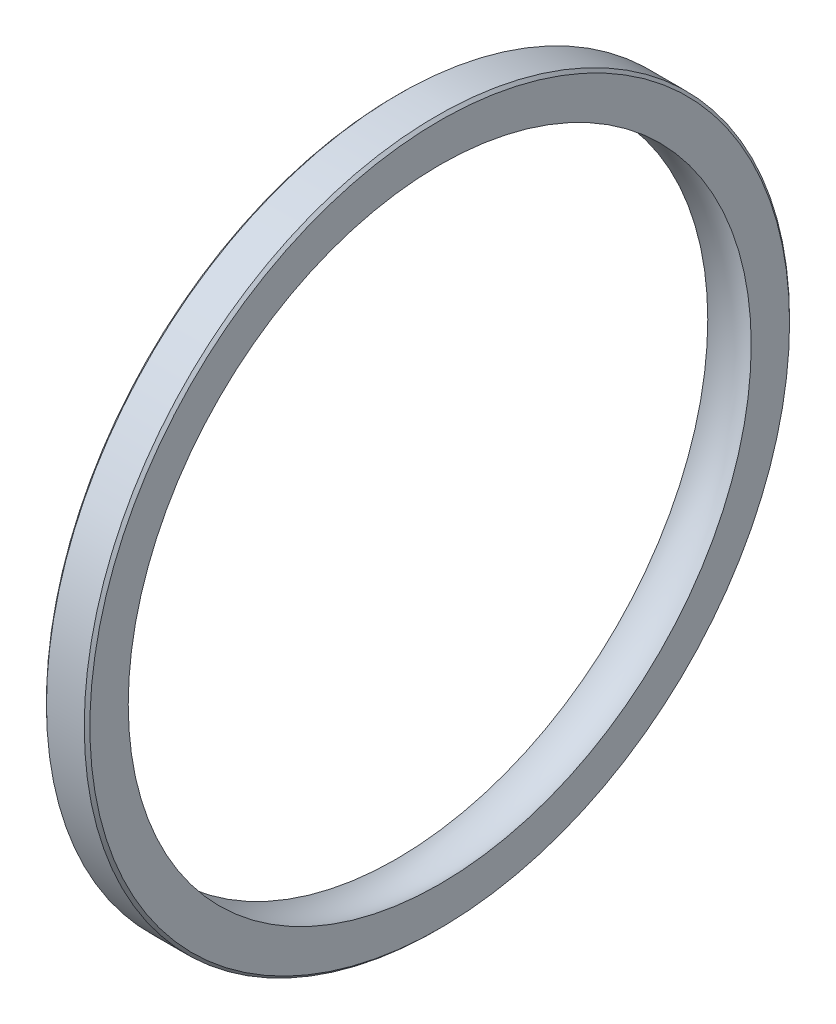
ISO-10303-21;
HEADER;
FILE_DESCRIPTION(('STEP AP214'),'2;1');
FILE_NAME('part.step','',(''),(''),'','','');
FILE_SCHEMA(('AUTOMOTIVE_DESIGN { 1 0 10303 214 1 1 1 1 }'));
ENDSEC;
DATA;
#1=APPLICATION_CONTEXT('core data for automotive mechanical design processes');
#2=APPLICATION_PROTOCOL_DEFINITION('international standard','automotive_design',2000,#1);
#3=PRODUCT_CONTEXT('',#1,'mechanical');
#4=PRODUCT('Part','Part','',(#3));
#5=PRODUCT_RELATED_PRODUCT_CATEGORY('part','',(#4));
#6=PRODUCT_DEFINITION_FORMATION('','',#4);
#7=PRODUCT_DEFINITION_CONTEXT('part definition',#1,'design');
#8=PRODUCT_DEFINITION('design','',#6,#7);
#9=PRODUCT_DEFINITION_SHAPE('','',#8);
#10=(LENGTH_UNIT() NAMED_UNIT(*) SI_UNIT(.MILLI.,.METRE.));
#11=(NAMED_UNIT(*) PLANE_ANGLE_UNIT() SI_UNIT($,.RADIAN.));
#12=(NAMED_UNIT(*) SI_UNIT($,.STERADIAN.) SOLID_ANGLE_UNIT());
#13=UNCERTAINTY_MEASURE_WITH_UNIT(LENGTH_MEASURE(1.E-05),#10,'distance_accuracy_value','');
#14=(GEOMETRIC_REPRESENTATION_CONTEXT(3) GLOBAL_UNCERTAINTY_ASSIGNED_CONTEXT((#13)) GLOBAL_UNIT_ASSIGNED_CONTEXT((#10,
#11,#12)) REPRESENTATION_CONTEXT('',''));
#15=CARTESIAN_POINT('',(0.,0.,0.));
#16=DIRECTION('',(0.,0.,1.));
#17=DIRECTION('',(1.,0.,0.));
#18=AXIS2_PLACEMENT_3D('',#15,#16,#17);
#19=CARTESIAN_POINT('',(5.46,0.,23.441213234645));
#20=DIRECTION('',(-1.,0.,0.));
#21=DIRECTION('',(0.,0.,1.));
#22=AXIS2_PLACEMENT_3D('',#19,#20,#21);
#23=PLANE('',#22);
#24=CARTESIAN_POINT('',(5.46,0.,0.));
#25=DIRECTION('',(1.,0.,0.));
#26=DIRECTION('',(0.,0.,1.));
#27=AXIS2_PLACEMENT_3D('',#24,#25,#26);
#28=CIRCLE('',#27,22.0824264692901);
#29=CARTESIAN_POINT('',(5.46,0.,22.0824264692901));
#30=VERTEX_POINT('',#29);
#31=EDGE_CURVE('E71',#30,#30,#28,.T.);
#32=ORIENTED_EDGE('',*,*,#31,.T.);
#33=EDGE_LOOP('',(#32));
#34=FACE_BOUND('',#33,.T.);
#35=CARTESIAN_POINT('',(5.46,0.,0.));
#36=DIRECTION('',(1.,0.,0.));
#37=DIRECTION('',(0.,0.,1.));
#38=AXIS2_PLACEMENT_3D('',#35,#36,#37);
#39=CIRCLE('',#38,24.8);
#40=CARTESIAN_POINT('',(5.46,0.,-24.8));
#41=VERTEX_POINT('',#40);
#42=EDGE_CURVE('E11',#41,#41,#39,.T.);
#43=ORIENTED_EDGE('',*,*,#42,.F.);
#44=EDGE_LOOP('',(#43));
#45=FACE_BOUND('',#44,.T.);
#46=ADVANCED_FACE('F17',(#34,#45),#23,.T.);
#47=CARTESIAN_POINT('',(8.54,0.,23.441213234645));
#48=DIRECTION('',(1.,0.,0.));
#49=DIRECTION('',(0.,0.,-1.));
#50=AXIS2_PLACEMENT_3D('',#47,#48,#49);
#51=PLANE('',#50);
#52=CARTESIAN_POINT('',(8.54,0.,0.));
#53=DIRECTION('',(1.,0.,0.));
#54=DIRECTION('',(0.,0.,1.));
#55=AXIS2_PLACEMENT_3D('',#52,#53,#54);
#56=CIRCLE('',#55,22.0824264692901);
#57=CARTESIAN_POINT('',(8.54,-22.0824264692901,0.));
#58=VERTEX_POINT('',#57);
#59=EDGE_CURVE('E69',#58,#58,#56,.T.);
#60=ORIENTED_EDGE('',*,*,#59,.F.);
#61=EDGE_LOOP('',(#60));
#62=FACE_BOUND('',#61,.T.);
#63=CARTESIAN_POINT('',(8.54,0.,0.));
#64=DIRECTION('',(1.,0.,0.));
#65=DIRECTION('',(0.,0.,1.));
#66=AXIS2_PLACEMENT_3D('',#63,#64,#65);
#67=CIRCLE('',#66,24.8);
#68=CARTESIAN_POINT('',(8.54,0.,-24.8));
#69=VERTEX_POINT('',#68);
#70=EDGE_CURVE('E21',#69,#69,#67,.T.);
#71=ORIENTED_EDGE('',*,*,#70,.T.);
#72=EDGE_LOOP('',(#71));
#73=FACE_BOUND('',#72,.T.);
#74=ADVANCED_FACE('F81',(#62,#73),#51,.T.);
#75=CARTESIAN_POINT('',(5.56,0.,0.));
#76=DIRECTION('',(1.,0.,0.));
#77=DIRECTION('',(0.,0.,1.));
#78=AXIS2_PLACEMENT_3D('',#75,#76,#77);
#79=CONICAL_SURFACE('',#78,24.9,0.785398163397447);
#80=ORIENTED_EDGE('',*,*,#42,.T.);
#81=EDGE_LOOP('',(#80));
#82=FACE_BOUND('',#81,.T.);
#83=CARTESIAN_POINT('',(5.66,0.,0.));
#84=DIRECTION('',(1.,0.,0.));
#85=DIRECTION('',(0.,0.,1.));
#86=AXIS2_PLACEMENT_3D('',#83,#84,#85);
#87=CIRCLE('',#86,25.);
#88=CARTESIAN_POINT('',(5.66,0.,-25.));
#89=VERTEX_POINT('',#88);
#90=EDGE_CURVE('E28',#89,#89,#87,.T.);
#91=ORIENTED_EDGE('',*,*,#90,.F.);
#92=EDGE_LOOP('',(#91));
#93=FACE_BOUND('',#92,.T.);
#94=ADVANCED_FACE('F84',(#82,#93),#79,.T.);
#95=CARTESIAN_POINT('',(7.,0.,0.));
#96=DIRECTION('',(1.,0.,0.));
#97=DIRECTION('',(0.,0.,1.));
#98=AXIS2_PLACEMENT_3D('',#95,#96,#97);
#99=CYLINDRICAL_SURFACE('',#98,25.);
#100=ORIENTED_EDGE('',*,*,#90,.T.);
#101=EDGE_LOOP('',(#100));
#102=FACE_BOUND('',#101,.T.);
#103=CARTESIAN_POINT('',(8.34,0.,0.));
#104=DIRECTION('',(1.,0.,0.));
#105=DIRECTION('',(0.,0.,1.));
#106=AXIS2_PLACEMENT_3D('',#103,#104,#105);
#107=CIRCLE('',#106,25.);
#108=CARTESIAN_POINT('',(8.34,0.,-25.));
#109=VERTEX_POINT('',#108);
#110=EDGE_CURVE('E57',#109,#109,#107,.T.);
#111=ORIENTED_EDGE('',*,*,#110,.F.);
#112=EDGE_LOOP('',(#111));
#113=FACE_BOUND('',#112,.T.);
#114=ADVANCED_FACE('F19',(#102,#113),#99,.T.);
#115=CARTESIAN_POINT('',(8.44,0.,0.));
#116=DIRECTION('',(-1.,0.,0.));
#117=DIRECTION('',(0.,0.,1.));
#118=AXIS2_PLACEMENT_3D('',#115,#116,#117);
#119=CONICAL_SURFACE('',#118,24.9,0.785398163397446);
#120=ORIENTED_EDGE('',*,*,#110,.T.);
#121=EDGE_LOOP('',(#120));
#122=FACE_BOUND('',#121,.T.);
#123=ORIENTED_EDGE('',*,*,#70,.F.);
#124=EDGE_LOOP('',(#123));
#125=FACE_BOUND('',#124,.T.);
#126=ADVANCED_FACE('F58',(#122,#125),#119,.T.);
#127=CARTESIAN_POINT('',(7.,0.,0.));
#128=DIRECTION('',(1.,0.,0.));
#129=DIRECTION('',(0.,1.,0.));
#130=AXIS2_PLACEMENT_3D('',#127,#128,#129);
#131=TOROIDAL_SURFACE('',#130,20.,2.59);
#132=ORIENTED_EDGE('',*,*,#59,.T.);
#133=EDGE_LOOP('',(#132));
#134=FACE_BOUND('',#133,.T.);
#135=ORIENTED_EDGE('',*,*,#31,.F.);
#136=EDGE_LOOP('',(#135));
#137=FACE_BOUND('',#136,.T.);
#138=ADVANCED_FACE('F78',(#134,#137),#131,.F.);
#139=CLOSED_SHELL('',(#46,#74,#94,#114,#126,#138));
#140=MANIFOLD_SOLID_BREP('B1',#139);
#141=ADVANCED_BREP_SHAPE_REPRESENTATION('',(#18,#140),#14);
#142=SHAPE_DEFINITION_REPRESENTATION(#9,#141);
ENDSEC;
END-ISO-10303-21;
